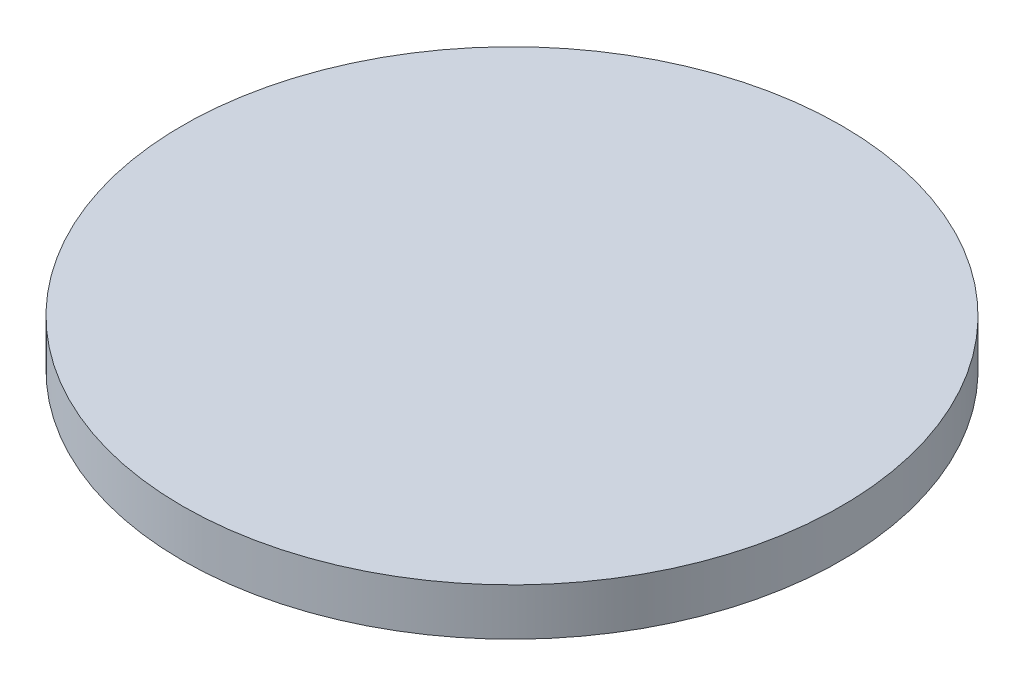
ISO-10303-21;
HEADER;
FILE_DESCRIPTION(('STEP AP214'),'2;1');
FILE_NAME('part.step','',(''),(''),'','','');
FILE_SCHEMA(('AUTOMOTIVE_DESIGN { 1 0 10303 214 1 1 1 1 }'));
ENDSEC;
DATA;
#1=APPLICATION_CONTEXT('core data for automotive mechanical design processes');
#2=APPLICATION_PROTOCOL_DEFINITION('international standard','automotive_design',2000,#1);
#3=PRODUCT_CONTEXT('',#1,'mechanical');
#4=PRODUCT('Part','Part','',(#3));
#5=PRODUCT_RELATED_PRODUCT_CATEGORY('part','',(#4));
#6=PRODUCT_DEFINITION_FORMATION('','',#4);
#7=PRODUCT_DEFINITION_CONTEXT('part definition',#1,'design');
#8=PRODUCT_DEFINITION('design','',#6,#7);
#9=PRODUCT_DEFINITION_SHAPE('','',#8);
#10=(LENGTH_UNIT() NAMED_UNIT(*) SI_UNIT(.MILLI.,.METRE.));
#11=(NAMED_UNIT(*) PLANE_ANGLE_UNIT() SI_UNIT($,.RADIAN.));
#12=(NAMED_UNIT(*) SI_UNIT($,.STERADIAN.) SOLID_ANGLE_UNIT());
#13=UNCERTAINTY_MEASURE_WITH_UNIT(LENGTH_MEASURE(1.E-05),#10,'distance_accuracy_value','');
#14=(GEOMETRIC_REPRESENTATION_CONTEXT(3) GLOBAL_UNCERTAINTY_ASSIGNED_CONTEXT((#13)) GLOBAL_UNIT_ASSIGNED_CONTEXT((#10,
#11,#12)) REPRESENTATION_CONTEXT('',''));
#15=CARTESIAN_POINT('',(0.,0.,0.));
#16=DIRECTION('',(0.,0.,1.));
#17=DIRECTION('',(1.,0.,0.));
#18=AXIS2_PLACEMENT_3D('',#15,#16,#17);
#19=CARTESIAN_POINT('',(0.,4.,0.));
#20=DIRECTION('',(0.,-1.,0.));
#21=DIRECTION('',(0.,0.,-1.));
#22=AXIS2_PLACEMENT_3D('',#19,#20,#21);
#23=CYLINDRICAL_SURFACE('',#22,28.);
#24=CARTESIAN_POINT('',(0.,4.,0.));
#25=DIRECTION('',(0.,1.,0.));
#26=DIRECTION('',(0.,0.,1.));
#27=AXIS2_PLACEMENT_3D('',#24,#25,#26);
#28=CIRCLE('',#27,28.);
#29=CARTESIAN_POINT('',(0.,4.,28.));
#30=VERTEX_POINT('',#29);
#31=EDGE_CURVE('E10',#30,#30,#28,.T.);
#32=ORIENTED_EDGE('',*,*,#31,.F.);
#33=EDGE_LOOP('',(#32));
#34=FACE_BOUND('',#33,.T.);
#35=CARTESIAN_POINT('',(0.,0.,0.));
#36=DIRECTION('',(0.,1.,0.));
#37=DIRECTION('',(0.,0.,1.));
#38=AXIS2_PLACEMENT_3D('',#35,#36,#37);
#39=CIRCLE('',#38,28.);
#40=CARTESIAN_POINT('',(0.,0.,28.));
#41=VERTEX_POINT('',#40);
#42=EDGE_CURVE('E42',#41,#41,#39,.T.);
#43=ORIENTED_EDGE('',*,*,#42,.T.);
#44=EDGE_LOOP('',(#43));
#45=FACE_BOUND('',#44,.T.);
#46=ADVANCED_FACE('F39',(#34,#45),#23,.T.);
#47=CARTESIAN_POINT('',(0.,4.,0.));
#48=DIRECTION('',(0.,1.,0.));
#49=DIRECTION('',(0.,0.,1.));
#50=AXIS2_PLACEMENT_3D('',#47,#48,#49);
#51=PLANE('',#50);
#52=ORIENTED_EDGE('',*,*,#31,.T.);
#53=EDGE_LOOP('',(#52));
#54=FACE_BOUND('',#53,.T.);
#55=ADVANCED_FACE('F54',(#54),#51,.T.);
#56=CARTESIAN_POINT('',(0.,0.,0.));
#57=DIRECTION('',(0.,1.,0.));
#58=DIRECTION('',(0.,0.,1.));
#59=AXIS2_PLACEMENT_3D('',#56,#57,#58);
#60=PLANE('',#59);
#61=ORIENTED_EDGE('',*,*,#42,.F.);
#62=EDGE_LOOP('',(#61));
#63=FACE_BOUND('',#62,.T.);
#64=ADVANCED_FACE('F52',(#63),#60,.F.);
#65=CLOSED_SHELL('',(#46,#55,#64));
#66=MANIFOLD_SOLID_BREP('B2',#65);
#67=ADVANCED_BREP_SHAPE_REPRESENTATION('',(#18,#66),#14);
#68=SHAPE_DEFINITION_REPRESENTATION(#9,#67);
ENDSEC;
END-ISO-10303-21;
